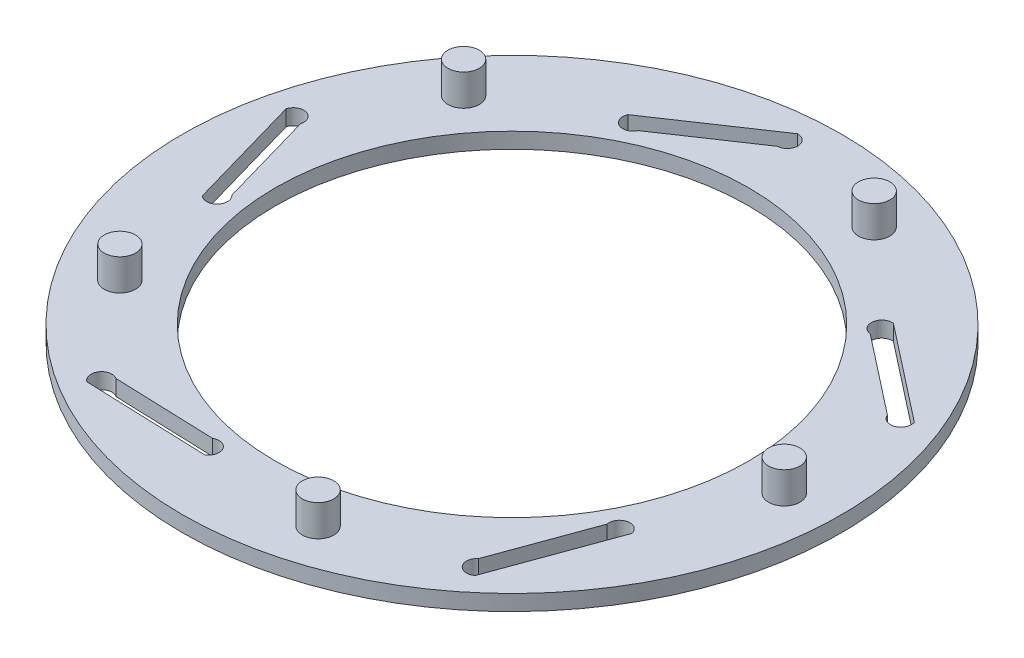
ISO-10303-21;
HEADER;
FILE_DESCRIPTION(('STEP AP214'),'2;1');
FILE_NAME('part.step','',(''),(''),'','','');
FILE_SCHEMA(('AUTOMOTIVE_DESIGN { 1 0 10303 214 1 1 1 1 }'));
ENDSEC;
DATA;
#1=APPLICATION_CONTEXT('core data for automotive mechanical design processes');
#2=APPLICATION_PROTOCOL_DEFINITION('international standard','automotive_design',2000,#1);
#3=PRODUCT_CONTEXT('',#1,'mechanical');
#4=PRODUCT('Part','Part','',(#3));
#5=PRODUCT_RELATED_PRODUCT_CATEGORY('part','',(#4));
#6=PRODUCT_DEFINITION_FORMATION('','',#4);
#7=PRODUCT_DEFINITION_CONTEXT('part definition',#1,'design');
#8=PRODUCT_DEFINITION('design','',#6,#7);
#9=PRODUCT_DEFINITION_SHAPE('','',#8);
#10=(LENGTH_UNIT() NAMED_UNIT(*) SI_UNIT(.MILLI.,.METRE.));
#11=(NAMED_UNIT(*) PLANE_ANGLE_UNIT() SI_UNIT($,.RADIAN.));
#12=(NAMED_UNIT(*) SI_UNIT($,.STERADIAN.) SOLID_ANGLE_UNIT());
#13=UNCERTAINTY_MEASURE_WITH_UNIT(LENGTH_MEASURE(1.E-05),#10,'distance_accuracy_value','');
#14=(GEOMETRIC_REPRESENTATION_CONTEXT(3) GLOBAL_UNCERTAINTY_ASSIGNED_CONTEXT((#13)) GLOBAL_UNIT_ASSIGNED_CONTEXT((#10,
#11,#12)) REPRESENTATION_CONTEXT('',''));
#15=CARTESIAN_POINT('',(0.,0.,0.));
#16=DIRECTION('',(0.,0.,1.));
#17=DIRECTION('',(1.,0.,0.));
#18=AXIS2_PLACEMENT_3D('',#15,#16,#17);
#19=CARTESIAN_POINT('',(-24.6164911308151,1.5,7.04147544452929));
#20=DIRECTION('',(-0.961439383617259,0.,0.275016929714635));
#21=DIRECTION('',(0.275016929714635,0.,0.961439383617259));
#22=AXIS2_PLACEMENT_3D('',#19,#20,#21);
#23=PLANE('',#22);
#24=DIRECTION('',(-0.275016929714635,0.,-0.961439383617259));
#25=VECTOR('',#24,1.);
#26=CARTESIAN_POINT('',(-24.6164911308151,0.,7.04147544452929));
#27=LINE('',#26,#25);
#28=CARTESIAN_POINT('',(-25.4396115620849,0.,4.16390568580963));
#29=VERTEX_POINT('',#28);
#30=CARTESIAN_POINT('',(-28.6472570750445,0.,-7.04979206015319));
#31=VERTEX_POINT('',#30);
#32=EDGE_CURVE('E284',#29,#31,#27,.T.);
#33=ORIENTED_EDGE('',*,*,#32,.T.);
#34=DIRECTION('',(0.,-1.,0.));
#35=VECTOR('',#34,1.);
#36=CARTESIAN_POINT('',(-28.6472570750445,1.5,-7.04979206015319));
#37=LINE('',#36,#35);
#38=CARTESIAN_POINT('',(-28.6472570750445,1.5,-7.04979206015319));
#39=VERTEX_POINT('',#38);
#40=EDGE_CURVE('E11',#39,#31,#37,.T.);
#41=ORIENTED_EDGE('',*,*,#40,.F.);
#42=DIRECTION('',(-0.275016929714635,0.,-0.961439383617259));
#43=VECTOR('',#42,1.);
#44=CARTESIAN_POINT('',(-24.6164911308151,1.5,7.04147544452929));
#45=LINE('',#44,#43);
#46=CARTESIAN_POINT('',(-25.4396115620849,1.5,4.16390568580963));
#47=VERTEX_POINT('',#46);
#48=EDGE_CURVE('E194',#47,#39,#45,.T.);
#49=ORIENTED_EDGE('',*,*,#48,.F.);
#50=DIRECTION('',(0.,-1.,0.));
#51=VECTOR('',#50,1.);
#52=CARTESIAN_POINT('',(-25.4396115620849,1.5,4.16390568580963));
#53=LINE('',#52,#51);
#54=EDGE_CURVE('E61',#47,#29,#53,.T.);
#55=ORIENTED_EDGE('',*,*,#54,.T.);
#56=EDGE_LOOP('',(#33,#41,#49,#55));
#57=FACE_BOUND('',#56,.T.);
#58=ADVANCED_FACE('F41',(#57),#23,.F.);
#59=CARTESIAN_POINT('',(-27.6839846912849,1.5,-6.78126587020875));
#60=DIRECTION('',(0.,-1.,0.));
#61=DIRECTION('',(0.,0.,-1.));
#62=AXIS2_PLACEMENT_3D('',#59,#60,#61);
#63=CYLINDRICAL_SURFACE('',#62,1.);
#64=CARTESIAN_POINT('',(-27.6839846912849,0.,-6.78126587020875));
#65=DIRECTION('',(0.,1.,0.));
#66=DIRECTION('',(0.,0.,1.));
#67=AXIS2_PLACEMENT_3D('',#64,#65,#66);
#68=CIRCLE('',#67,1.);
#69=CARTESIAN_POINT('',(-26.7207123075253,0.,-6.51273968026431));
#70=VERTEX_POINT('',#69);
#71=EDGE_CURVE('E201',#31,#70,#68,.F.);
#72=ORIENTED_EDGE('',*,*,#71,.T.);
#73=DIRECTION('',(0.,-1.,0.));
#74=VECTOR('',#73,1.);
#75=CARTESIAN_POINT('',(-26.7207123075253,1.5,-6.51273968026431));
#76=LINE('',#75,#74);
#77=CARTESIAN_POINT('',(-26.7207123075253,1.5,-6.51273968026431));
#78=VERTEX_POINT('',#77);
#79=EDGE_CURVE('E52',#78,#70,#76,.T.);
#80=ORIENTED_EDGE('',*,*,#79,.F.);
#81=CARTESIAN_POINT('',(-27.6839846912849,1.5,-6.78126587020875));
#82=DIRECTION('',(0.,1.,0.));
#83=DIRECTION('',(0.,0.,1.));
#84=AXIS2_PLACEMENT_3D('',#81,#82,#83);
#85=CIRCLE('',#84,1.);
#86=EDGE_CURVE('E188',#39,#78,#85,.F.);
#87=ORIENTED_EDGE('',*,*,#86,.F.);
#88=ORIENTED_EDGE('',*,*,#40,.T.);
#89=EDGE_LOOP('',(#72,#80,#87,#88));
#90=FACE_BOUND('',#89,.T.);
#91=ADVANCED_FACE('F200',(#90),#63,.F.);
#92=CARTESIAN_POINT('',(-22.9776624021557,1.5,6.57269326963195));
#93=DIRECTION('',(0.961439383617259,0.,-0.275016929714634));
#94=DIRECTION('',(-0.275016929714634,0.,-0.96143938361726));
#95=AXIS2_PLACEMENT_3D('',#92,#93,#94);
#96=PLANE('',#95);
#97=DIRECTION('',(0.275016929714634,0.,0.96143938361726));
#98=VECTOR('',#97,1.);
#99=CARTESIAN_POINT('',(-22.9776624021557,0.,6.57269326963195));
#100=LINE('',#99,#98);
#101=CARTESIAN_POINT('',(-24.0884988722853,0.,2.6892889561261));
#102=VERTEX_POINT('',#101);
#103=EDGE_CURVE('E289',#70,#102,#100,.T.);
#104=ORIENTED_EDGE('',*,*,#103,.T.);
#105=DIRECTION('',(0.,-1.,0.));
#106=VECTOR('',#105,1.);
#107=CARTESIAN_POINT('',(-24.0884988722853,1.5,2.6892889561261));
#108=LINE('',#107,#106);
#109=CARTESIAN_POINT('',(-24.0884988722853,1.5,2.6892889561261));
#110=VERTEX_POINT('',#109);
#111=EDGE_CURVE('E124',#110,#102,#108,.T.);
#112=ORIENTED_EDGE('',*,*,#111,.F.);
#113=DIRECTION('',(0.275016929714634,0.,0.96143938361726));
#114=VECTOR('',#113,1.);
#115=CARTESIAN_POINT('',(-22.9776624021557,1.5,6.57269326963195));
#116=LINE('',#115,#114);
#117=EDGE_CURVE('E193',#78,#110,#116,.T.);
#118=ORIENTED_EDGE('',*,*,#117,.F.);
#119=ORIENTED_EDGE('',*,*,#79,.T.);
#120=EDGE_LOOP('',(#104,#112,#118,#119));
#121=FACE_BOUND('',#120,.T.);
#122=ADVANCED_FACE('F206',(#121),#96,.F.);
#123=CARTESIAN_POINT('',(-0.910072995450213,1.5,25.5876098761187));
#124=DIRECTION('',(-0.0355444655025184,0.,0.999368095834633));
#125=DIRECTION('',(0.999368095834633,0.,0.0355444655025184));
#126=AXIS2_PLACEMENT_3D('',#123,#124,#125);
#127=PLANE('',#126);
#128=DIRECTION('',(-0.999368095834633,0.,-0.0355444655025184));
#129=VECTOR('',#128,1.);
#130=CARTESIAN_POINT('',(-0.910072995450213,0.,25.5876098761187));
#131=LINE('',#130,#129);
#132=CARTESIAN_POINT('',(-3.90116266725078,0.,25.4812259680298));
#133=VERTEX_POINT('',#132);
#134=CARTESIAN_POINT('',(-15.5572399557481,0.,25.0666549618084));
#135=VERTEX_POINT('',#134);
#136=EDGE_CURVE('E269',#133,#135,#131,.T.);
#137=ORIENTED_EDGE('',*,*,#136,.T.);
#138=DIRECTION('',(0.,-1.,0.));
#139=VECTOR('',#138,1.);
#140=CARTESIAN_POINT('',(-15.5572399557481,1.5,25.0666549618084));
#141=LINE('',#140,#139);
#142=CARTESIAN_POINT('',(-15.5572399557481,1.5,25.0666549618084));
#143=VERTEX_POINT('',#142);
#144=EDGE_CURVE('E299',#143,#135,#141,.T.);
#145=ORIENTED_EDGE('',*,*,#144,.F.);
#146=DIRECTION('',(-0.999368095834633,0.,-0.0355444655025184));
#147=VECTOR('',#146,1.);
#148=CARTESIAN_POINT('',(-0.910072995450213,1.5,25.5876098761187));
#149=LINE('',#148,#147);
#150=CARTESIAN_POINT('',(-3.90116266725078,1.5,25.4812259680298));
#151=VERTEX_POINT('',#150);
#152=EDGE_CURVE('E779',#151,#143,#149,.T.);
#153=ORIENTED_EDGE('',*,*,#152,.F.);
#154=DIRECTION('',(0.,-1.,0.));
#155=VECTOR('',#154,1.);
#156=CARTESIAN_POINT('',(-3.90116266725078,1.5,25.4812259680298));
#157=LINE('',#156,#155);
#158=EDGE_CURVE('E302',#151,#133,#157,.T.);
#159=ORIENTED_EDGE('',*,*,#158,.T.);
#160=EDGE_LOOP('',(#137,#145,#153,#159));
#161=FACE_BOUND('',#160,.T.);
#162=ADVANCED_FACE('F399',(#161),#127,.F.);
#163=CARTESIAN_POINT('',(-15.0041888362117,1.5,24.2335076403943));
#164=DIRECTION('',(0.,-1.,0.));
#165=DIRECTION('',(0.,0.,-1.));
#166=AXIS2_PLACEMENT_3D('',#163,#164,#165);
#167=CYLINDRICAL_SURFACE('',#166,1.00000000000001);
#168=CARTESIAN_POINT('',(-15.0041888362117,0.,24.2335076403943));
#169=DIRECTION('',(0.,1.,0.));
#170=DIRECTION('',(0.,0.,1.));
#171=AXIS2_PLACEMENT_3D('',#168,#169,#170);
#172=CIRCLE('',#171,1.00000000000001);
#173=CARTESIAN_POINT('',(-14.4511377166754,0.,23.4003603189801));
#174=VERTEX_POINT('',#173);
#175=EDGE_CURVE('E273',#135,#174,#172,.F.);
#176=ORIENTED_EDGE('',*,*,#175,.T.);
#177=DIRECTION('',(0.,-1.,0.));
#178=VECTOR('',#177,1.);
#179=CARTESIAN_POINT('',(-14.4511377166754,1.5,23.4003603189801));
#180=LINE('',#179,#178);
#181=CARTESIAN_POINT('',(-14.4511377166754,1.5,23.4003603189801));
#182=VERTEX_POINT('',#181);
#183=EDGE_CURVE('E309',#182,#174,#180,.T.);
#184=ORIENTED_EDGE('',*,*,#183,.F.);
#185=CARTESIAN_POINT('',(-15.0041888362117,1.5,24.2335076403943));
#186=DIRECTION('',(0.,1.,0.));
#187=DIRECTION('',(0.,0.,1.));
#188=AXIS2_PLACEMENT_3D('',#185,#186,#187);
#189=CIRCLE('',#188,1.00000000000001);
#190=EDGE_CURVE('E783',#143,#182,#189,.F.);
#191=ORIENTED_EDGE('',*,*,#190,.F.);
#192=ORIENTED_EDGE('',*,*,#144,.T.);
#193=EDGE_LOOP('',(#176,#184,#191,#192));
#194=FACE_BOUND('',#193,.T.);
#195=ADVANCED_FACE('F395',(#194),#167,.F.);
#196=CARTESIAN_POINT('',(-0.849485409583704,1.5,23.8841294759322));
#197=DIRECTION('',(0.0355444655025191,0.,-0.999368095834633));
#198=DIRECTION('',(-0.999368095834633,0.,-0.0355444655025191));
#199=AXIS2_PLACEMENT_3D('',#196,#197,#198);
#200=PLANE('',#199);
#201=DIRECTION('',(0.999368095834633,0.,0.0355444655025191));
#202=VECTOR('',#201,1.);
#203=CARTESIAN_POINT('',(-0.849485409583704,0.,23.8841294759322));
#204=LINE('',#203,#202);
#205=CARTESIAN_POINT('',(-4.88608973459044,0.,23.740559810485));
#206=VERTEX_POINT('',#205);
#207=EDGE_CURVE('E276',#174,#206,#204,.T.);
#208=ORIENTED_EDGE('',*,*,#207,.T.);
#209=DIRECTION('',(0.,-1.,0.));
#210=VECTOR('',#209,1.);
#211=CARTESIAN_POINT('',(-4.88608973459044,1.5,23.740559810485));
#212=LINE('',#211,#210);
#213=CARTESIAN_POINT('',(-4.88608973459044,1.5,23.740559810485));
#214=VERTEX_POINT('',#213);
#215=EDGE_CURVE('E305',#214,#206,#212,.T.);
#216=ORIENTED_EDGE('',*,*,#215,.F.);
#217=DIRECTION('',(0.999368095834633,0.,0.0355444655025191));
#218=VECTOR('',#217,1.);
#219=CARTESIAN_POINT('',(-0.849485409583704,1.5,23.8841294759322));
#220=LINE('',#219,#218);
#221=EDGE_CURVE('E786',#182,#214,#220,.T.);
#222=ORIENTED_EDGE('',*,*,#221,.F.);
#223=ORIENTED_EDGE('',*,*,#183,.T.);
#224=EDGE_LOOP('',(#208,#216,#222,#223));
#225=FACE_BOUND('',#224,.T.);
#226=ADVANCED_FACE('F391',(#225),#200,.F.);
#227=CARTESIAN_POINT('',(24.0540350873885,1.5,8.77253714978533));
#228=DIRECTION('',(0.939471695824755,0.,0.342626520783431));
#229=DIRECTION('',(0.342626520783431,0.,-0.939471695824755));
#230=AXIS2_PLACEMENT_3D('',#227,#228,#229);
#231=PLANE('',#230);
#232=DIRECTION('',(-0.342626520783431,0.,0.939471695824755));
#233=VECTOR('',#232,1.);
#234=CARTESIAN_POINT('',(24.0540350873885,0.,8.77253714978533));
#235=LINE('',#234,#233);
#236=CARTESIAN_POINT('',(23.0285604380856,0.,11.5843580374475));
#237=VERTEX_POINT('',#236);
#238=CARTESIAN_POINT('',(19.0323540112582,0.,22.5418368108153));
#239=VERTEX_POINT('',#238);
#240=EDGE_CURVE('E254',#237,#239,#235,.T.);
#241=ORIENTED_EDGE('',*,*,#240,.T.);
#242=DIRECTION('',(0.,-1.,0.));
#243=VECTOR('',#242,1.);
#244=CARTESIAN_POINT('',(19.0323540112582,1.5,22.5418368108153));
#245=LINE('',#244,#243);
#246=CARTESIAN_POINT('',(19.0323540112582,1.5,22.5418368108153));
#247=VERTEX_POINT('',#246);
#248=EDGE_CURVE('E306',#247,#239,#245,.T.);
#249=ORIENTED_EDGE('',*,*,#248,.F.);
#250=DIRECTION('',(-0.342626520783431,0.,0.939471695824755));
#251=VECTOR('',#250,1.);
#252=CARTESIAN_POINT('',(24.0540350873885,1.5,8.77253714978533));
#253=LINE('',#252,#251);
#254=CARTESIAN_POINT('',(23.0285604380856,1.5,11.5843580374475));
#255=VERTEX_POINT('',#254);
#256=EDGE_CURVE('E765',#255,#247,#253,.T.);
#257=ORIENTED_EDGE('',*,*,#256,.F.);
#258=DIRECTION('',(0.,-1.,0.));
#259=VECTOR('',#258,1.);
#260=CARTESIAN_POINT('',(23.0285604380856,1.5,11.5843580374475));
#261=LINE('',#260,#259);
#262=EDGE_CURVE('E316',#255,#237,#261,.T.);
#263=ORIENTED_EDGE('',*,*,#262,.T.);
#264=EDGE_LOOP('',(#241,#249,#257,#263));
#265=FACE_BOUND('',#264,.T.);
#266=ADVANCED_FACE('F394',(#265),#231,.F.);
#267=CARTESIAN_POINT('',(18.4108860168882,1.5,21.7583972586009));
#268=DIRECTION('',(0.,-1.,0.));
#269=DIRECTION('',(0.,0.,-1.));
#270=AXIS2_PLACEMENT_3D('',#267,#268,#269);
#271=CYLINDRICAL_SURFACE('',#270,1.);
#272=CARTESIAN_POINT('',(18.4108860168882,0.,21.7583972586009));
#273=DIRECTION('',(0.,1.,0.));
#274=DIRECTION('',(0.,0.,1.));
#275=AXIS2_PLACEMENT_3D('',#272,#273,#274);
#276=CIRCLE('',#275,1.);
#277=CARTESIAN_POINT('',(17.7894180225183,0.,20.9749577063866));
#278=VERTEX_POINT('',#277);
#279=EDGE_CURVE('E258',#239,#278,#276,.F.);
#280=ORIENTED_EDGE('',*,*,#279,.T.);
#281=DIRECTION('',(0.,-1.,0.));
#282=VECTOR('',#281,1.);
#283=CARTESIAN_POINT('',(17.7894180225183,1.5,20.9749577063866));
#284=LINE('',#283,#282);
#285=CARTESIAN_POINT('',(17.7894180225183,1.5,20.9749577063866));
#286=VERTEX_POINT('',#285);
#287=EDGE_CURVE('E323',#286,#278,#284,.T.);
#288=ORIENTED_EDGE('',*,*,#287,.F.);
#289=CARTESIAN_POINT('',(18.4108860168882,1.5,21.7583972586009));
#290=DIRECTION('',(0.,1.,0.));
#291=DIRECTION('',(0.,0.,1.));
#292=AXIS2_PLACEMENT_3D('',#289,#290,#291);
#293=CIRCLE('',#292,1.);
#294=EDGE_CURVE('E769',#247,#286,#293,.F.);
#295=ORIENTED_EDGE('',*,*,#294,.F.);
#296=ORIENTED_EDGE('',*,*,#248,.T.);
#297=EDGE_LOOP('',(#280,#288,#295,#296));
#298=FACE_BOUND('',#297,.T.);
#299=ADVANCED_FACE('F412',(#298),#271,.F.);
#300=CARTESIAN_POINT('',(22.4526515460909,1.5,8.1885105381981));
#301=DIRECTION('',(-0.939471695824755,0.,-0.342626520783431));
#302=DIRECTION('',(-0.342626520783431,0.,0.939471695824755));
#303=AXIS2_PLACEMENT_3D('',#300,#301,#302);
#304=PLANE('',#303);
#305=DIRECTION('',(0.342626520783432,0.,-0.939471695824755));
#306=VECTOR('',#305,1.);
#307=CARTESIAN_POINT('',(22.4526515460909,0.,8.1885105381981));
#308=LINE('',#307,#306);
#309=CARTESIAN_POINT('',(21.0687293442304,0.,11.9831839187016));
#310=VERTEX_POINT('',#309);
#311=EDGE_CURVE('E261',#278,#310,#308,.T.);
#312=ORIENTED_EDGE('',*,*,#311,.T.);
#313=DIRECTION('',(0.,-1.,0.));
#314=VECTOR('',#313,1.);
#315=CARTESIAN_POINT('',(21.0687293442304,1.5,11.9831839187016));
#316=LINE('',#315,#314);
#317=CARTESIAN_POINT('',(21.0687293442304,1.5,11.9831839187016));
#318=VERTEX_POINT('',#317);
#319=EDGE_CURVE('E319',#318,#310,#316,.T.);
#320=ORIENTED_EDGE('',*,*,#319,.F.);
#321=DIRECTION('',(0.342626520783432,0.,-0.939471695824755));
#322=VECTOR('',#321,1.);
#323=CARTESIAN_POINT('',(22.4526515460909,1.5,8.1885105381981));
#324=LINE('',#323,#322);
#325=EDGE_CURVE('E772',#286,#318,#324,.T.);
#326=ORIENTED_EDGE('',*,*,#325,.F.);
#327=ORIENTED_EDGE('',*,*,#287,.T.);
#328=EDGE_LOOP('',(#312,#320,#326,#327));
#329=FACE_BOUND('',#328,.T.);
#330=ADVANCED_FACE('F408',(#329),#304,.F.);
#331=CARTESIAN_POINT('',(15.7762842460393,1.5,-20.1658837499842));
#332=DIRECTION('',(0.61616990499072,0.,-0.78761326054335));
#333=DIRECTION('',(-0.78761326054335,0.,-0.61616990499072));
#334=AXIS2_PLACEMENT_3D('',#331,#332,#333);
#335=PLANE('',#334);
#336=DIRECTION('',(0.78761326054335,0.,0.61616990499072));
#337=VECTOR('',#336,1.);
#338=CARTESIAN_POINT('',(15.7762842460393,0.,-20.1658837499842));
#339=LINE('',#338,#337);
#340=CARTESIAN_POINT('',(18.1335957299727,0.,-18.321698963041));
#341=VERTEX_POINT('',#340);
#342=CARTESIAN_POINT('',(27.31988162063,0.,-11.1350336438728));
#343=VERTEX_POINT('',#342);
#344=EDGE_CURVE('E239',#341,#343,#339,.T.);
#345=ORIENTED_EDGE('',*,*,#344,.T.);
#346=DIRECTION('',(0.,-1.,0.));
#347=VECTOR('',#346,1.);
#348=CARTESIAN_POINT('',(27.31988162063,1.5,-11.1350336438728));
#349=LINE('',#348,#347);
#350=CARTESIAN_POINT('',(27.31988162063,1.5,-11.1350336438728));
#351=VERTEX_POINT('',#350);
#352=EDGE_CURVE('E320',#351,#343,#349,.T.);
#353=ORIENTED_EDGE('',*,*,#352,.F.);
#354=DIRECTION('',(0.78761326054335,0.,0.61616990499072));
#355=VECTOR('',#354,1.);
#356=CARTESIAN_POINT('',(15.7762842460393,1.5,-20.1658837499842));
#357=LINE('',#356,#355);
#358=CARTESIAN_POINT('',(18.1335957299727,1.5,-18.321698963041));
#359=VERTEX_POINT('',#358);
#360=EDGE_CURVE('E751',#359,#351,#357,.T.);
#361=ORIENTED_EDGE('',*,*,#360,.F.);
#362=DIRECTION('',(0.,-1.,0.));
#363=VECTOR('',#362,1.);
#364=CARTESIAN_POINT('',(18.1335957299727,1.5,-18.321698963041));
#365=LINE('',#364,#363);
#366=EDGE_CURVE('E330',#359,#341,#365,.T.);
#367=ORIENTED_EDGE('',*,*,#366,.T.);
#368=EDGE_LOOP('',(#345,#353,#361,#367));
#369=FACE_BOUND('',#368,.T.);
#370=ADVANCED_FACE('F411',(#369),#335,.F.);
#371=CARTESIAN_POINT('',(26.3827421576527,1.5,-10.7860785938581));
#372=DIRECTION('',(0.,-1.,0.));
#373=DIRECTION('',(0.,0.,-1.));
#374=AXIS2_PLACEMENT_3D('',#371,#372,#373);
#375=CYLINDRICAL_SURFACE('',#374,1.);
#376=CARTESIAN_POINT('',(26.3827421576527,0.,-10.7860785938581));
#377=DIRECTION('',(0.,1.,0.));
#378=DIRECTION('',(0.,0.,1.));
#379=AXIS2_PLACEMENT_3D('',#376,#377,#378);
#380=CIRCLE('',#379,1.);
#381=CARTESIAN_POINT('',(25.4456026946755,0.,-10.4371235438434));
#382=VERTEX_POINT('',#381);
#383=EDGE_CURVE('E243',#343,#382,#380,.F.);
#384=ORIENTED_EDGE('',*,*,#383,.T.);
#385=DIRECTION('',(0.,-1.,0.));
#386=VECTOR('',#385,1.);
#387=CARTESIAN_POINT('',(25.4456026946755,1.5,-10.4371235438434));
#388=LINE('',#387,#386);
#389=CARTESIAN_POINT('',(25.4456026946755,1.5,-10.4371235438434));
#390=VERTEX_POINT('',#389);
#391=EDGE_CURVE('E336',#390,#382,#388,.T.);
#392=ORIENTED_EDGE('',*,*,#391,.F.);
#393=CARTESIAN_POINT('',(26.3827421576527,1.5,-10.7860785938581));
#394=DIRECTION('',(0.,1.,0.));
#395=DIRECTION('',(0.,0.,1.));
#396=AXIS2_PLACEMENT_3D('',#393,#394,#395);
#397=CIRCLE('',#396,1.);
#398=EDGE_CURVE('E755',#351,#390,#397,.F.);
#399=ORIENTED_EDGE('',*,*,#398,.F.);
#400=ORIENTED_EDGE('',*,*,#352,.T.);
#401=EDGE_LOOP('',(#384,#392,#399,#400));
#402=FACE_BOUND('',#401,.T.);
#403=ADVANCED_FACE('F426',(#402),#375,.F.);
#404=CARTESIAN_POINT('',(14.7259872026262,1.5,-18.823351646093));
#405=DIRECTION('',(-0.61616990499072,0.,0.78761326054335));
#406=DIRECTION('',(0.78761326054335,0.,0.61616990499072));
#407=AXIS2_PLACEMENT_3D('',#404,#405,#406);
#408=PLANE('',#407);
#409=DIRECTION('',(-0.78761326054335,0.,-0.61616990499072));
#410=VECTOR('',#409,1.);
#411=CARTESIAN_POINT('',(14.7259872026262,0.,-18.823351646093));
#412=LINE('',#411,#410);
#413=CARTESIAN_POINT('',(17.907280569101,0.,-16.334544855288));
#414=VERTEX_POINT('',#413);
#415=EDGE_CURVE('E246',#382,#414,#412,.T.);
#416=ORIENTED_EDGE('',*,*,#415,.T.);
#417=DIRECTION('',(0.,-1.,0.));
#418=VECTOR('',#417,1.);
#419=CARTESIAN_POINT('',(17.907280569101,1.5,-16.334544855288));
#420=LINE('',#419,#418);
#421=CARTESIAN_POINT('',(17.907280569101,1.5,-16.334544855288));
#422=VERTEX_POINT('',#421);
#423=EDGE_CURVE('E333',#422,#414,#420,.T.);
#424=ORIENTED_EDGE('',*,*,#423,.F.);
#425=DIRECTION('',(-0.78761326054335,0.,-0.61616990499072));
#426=VECTOR('',#425,1.);
#427=CARTESIAN_POINT('',(14.7259872026262,1.5,-18.823351646093));
#428=LINE('',#427,#426);
#429=EDGE_CURVE('E758',#390,#422,#428,.T.);
#430=ORIENTED_EDGE('',*,*,#429,.F.);
#431=ORIENTED_EDGE('',*,*,#391,.T.);
#432=EDGE_LOOP('',(#416,#424,#430,#431));
#433=FACE_BOUND('',#432,.T.);
#434=ADVANCED_FACE('F423',(#433),#408,.F.);
#435=CARTESIAN_POINT('',(-14.3037552071553,1.5,-21.2357387204523));
#436=DIRECTION('',(-0.558657751695696,0.,-0.829398285789348));
#437=DIRECTION('',(-0.829398285789348,0.,0.558657751695697));
#438=AXIS2_PLACEMENT_3D('',#435,#436,#437);
#439=PLANE('',#438);
#440=DIRECTION('',(0.829398285789348,0.,-0.558657751695696));
#441=VECTOR('',#440,1.);
#442=CARTESIAN_POINT('',(-14.3037552071553,0.,-21.2357387204523));
#443=LINE('',#442,#441);
#444=CARTESIAN_POINT('',(-11.8213819387086,0.,-22.9077907282523));
#445=VERTEX_POINT('',#444);
#446=CARTESIAN_POINT('',(-2.14773860108144,0.,-29.423666068604));
#447=VERTEX_POINT('',#446);
#448=EDGE_CURVE('E224',#445,#447,#443,.T.);
#449=ORIENTED_EDGE('',*,*,#448,.T.);
#450=DIRECTION('',(0.,-1.,0.));
#451=VECTOR('',#450,1.);
#452=CARTESIAN_POINT('',(-2.14773860108144,1.5,-29.423666068604));
#453=LINE('',#452,#451);
#454=CARTESIAN_POINT('',(-2.14773860108144,1.5,-29.423666068604));
#455=VERTEX_POINT('',#454);
#456=EDGE_CURVE('E45',#455,#447,#453,.T.);
#457=ORIENTED_EDGE('',*,*,#456,.F.);
#458=DIRECTION('',(0.829398285789348,0.,-0.558657751695696));
#459=VECTOR('',#458,1.);
#460=CARTESIAN_POINT('',(-14.3037552071553,1.5,-21.2357387204523));
#461=LINE('',#460,#459);
#462=CARTESIAN_POINT('',(-11.8213819387086,1.5,-22.9077907282523));
#463=VERTEX_POINT('',#462);
#464=EDGE_CURVE('E741',#463,#455,#461,.T.);
#465=ORIENTED_EDGE('',*,*,#464,.F.);
#466=DIRECTION('',(0.,-1.,0.));
#467=VECTOR('',#466,1.);
#468=CARTESIAN_POINT('',(-11.8213819387086,1.5,-22.9077907282523));
#469=LINE('',#468,#467);
#470=EDGE_CURVE('E211',#463,#445,#469,.T.);
#471=ORIENTED_EDGE('',*,*,#470,.T.);
#472=EDGE_LOOP('',(#449,#457,#465,#471));
#473=FACE_BOUND('',#472,.T.);
#474=ADVANCED_FACE('F359',(#473),#439,.F.);
#475=CARTESIAN_POINT('',(-2.10545464703022,1.5,-28.4245604349347));
#476=DIRECTION('',(0.,-1.,0.));
#477=DIRECTION('',(0.,0.,-1.));
#478=AXIS2_PLACEMENT_3D('',#475,#476,#477);
#479=CYLINDRICAL_SURFACE('',#478,1.);
#480=CARTESIAN_POINT('',(-2.10545464703022,0.,-28.4245604349347));
#481=DIRECTION('',(0.,1.,0.));
#482=DIRECTION('',(0.,0.,1.));
#483=AXIS2_PLACEMENT_3D('',#480,#481,#482);
#484=CIRCLE('',#483,1.);
#485=CARTESIAN_POINT('',(-2.06317069297901,0.,-27.4254548012654));
#486=VERTEX_POINT('',#485);
#487=EDGE_CURVE('E228',#447,#486,#484,.F.);
#488=ORIENTED_EDGE('',*,*,#487,.T.);
#489=DIRECTION('',(0.,-1.,0.));
#490=VECTOR('',#489,1.);
#491=CARTESIAN_POINT('',(-2.06317069297901,1.5,-27.4254548012654));
#492=LINE('',#491,#490);
#493=CARTESIAN_POINT('',(-2.06317069297901,1.5,-27.4254548012654));
#494=VERTEX_POINT('',#493);
#495=EDGE_CURVE('E347',#494,#486,#492,.T.);
#496=ORIENTED_EDGE('',*,*,#495,.F.);
#497=CARTESIAN_POINT('',(-2.10545464703022,1.5,-28.4245604349347));
#498=DIRECTION('',(0.,1.,0.));
#499=DIRECTION('',(0.,0.,1.));
#500=AXIS2_PLACEMENT_3D('',#497,#498,#499);
#501=CIRCLE('',#500,1.);
#502=EDGE_CURVE('E137',#455,#494,#501,.F.);
#503=ORIENTED_EDGE('',*,*,#502,.F.);
#504=ORIENTED_EDGE('',*,*,#456,.T.);
#505=EDGE_LOOP('',(#488,#496,#503,#504));
#506=FACE_BOUND('',#505,.T.);
#507=ADVANCED_FACE('F355',(#506),#479,.F.);
#508=CARTESIAN_POINT('',(-13.3514909369706,1.5,-19.8219816376724));
#509=DIRECTION('',(0.558657751695697,0.,0.829398285789348));
#510=DIRECTION('',(0.829398285789348,0.,-0.558657751695697));
#511=AXIS2_PLACEMENT_3D('',#508,#509,#510);
#512=PLANE('',#511);
#513=DIRECTION('',(-0.829398285789348,0.,0.558657751695697));
#514=VECTOR('',#513,1.);
#515=CARTESIAN_POINT('',(-13.3514909369706,0.,-19.8219816376724));
#516=LINE('',#515,#514);
#517=CARTESIAN_POINT('',(-10.0014213064415,0.,-22.0784878300311));
#518=VERTEX_POINT('',#517);
#519=EDGE_CURVE('E231',#486,#518,#516,.T.);
#520=ORIENTED_EDGE('',*,*,#519,.T.);
#521=DIRECTION('',(0.,-1.,0.));
#522=VECTOR('',#521,1.);
#523=CARTESIAN_POINT('',(-10.0014213064415,1.5,-22.0784878300311));
#524=LINE('',#523,#522);
#525=CARTESIAN_POINT('',(-10.0014213064415,1.5,-22.0784878300311));
#526=VERTEX_POINT('',#525);
#527=EDGE_CURVE('E345',#526,#518,#524,.T.);
#528=ORIENTED_EDGE('',*,*,#527,.F.);
#529=DIRECTION('',(-0.829398285789348,0.,0.558657751695697));
#530=VECTOR('',#529,1.);
#531=CARTESIAN_POINT('',(-13.3514909369706,1.5,-19.8219816376724));
#532=LINE('',#531,#530);
#533=EDGE_CURVE('E746',#494,#526,#532,.T.);
#534=ORIENTED_EDGE('',*,*,#533,.F.);
#535=ORIENTED_EDGE('',*,*,#495,.T.);
#536=EDGE_LOOP('',(#520,#528,#534,#535));
#537=FACE_BOUND('',#536,.T.);
#538=ADVANCED_FACE('F370',(#537),#512,.F.);
#539=CARTESIAN_POINT('',(-4.39362620092061,1.5,24.6108928892574));
#540=DIRECTION('',(0.,-1.,0.));
#541=DIRECTION('',(0.,0.,-1.));
#542=AXIS2_PLACEMENT_3D('',#539,#540,#541);
#543=CYLINDRICAL_SURFACE('',#542,1.);
#544=CARTESIAN_POINT('',(-4.39362620092061,0.,24.6108928892574));
#545=DIRECTION('',(0.,1.,0.));
#546=DIRECTION('',(0.,0.,1.));
#547=AXIS2_PLACEMENT_3D('',#544,#545,#546);
#548=CIRCLE('',#547,1.);
#549=EDGE_CURVE('E280',#133,#206,#548,.T.);
#550=ORIENTED_EDGE('',*,*,#549,.F.);
#551=ORIENTED_EDGE('',*,*,#158,.F.);
#552=CARTESIAN_POINT('',(-4.39362620092061,1.5,24.6108928892574));
#553=DIRECTION('',(0.,1.,0.));
#554=DIRECTION('',(0.,0.,1.));
#555=AXIS2_PLACEMENT_3D('',#552,#553,#554);
#556=CIRCLE('',#555,1.);
#557=EDGE_CURVE('E789',#151,#214,#556,.T.);
#558=ORIENTED_EDGE('',*,*,#557,.T.);
#559=ORIENTED_EDGE('',*,*,#215,.T.);
#560=EDGE_LOOP('',(#550,#551,#558,#559));
#561=FACE_BOUND('',#560,.T.);
#562=ADVANCED_FACE('F372',(#561),#543,.F.);
#563=CARTESIAN_POINT('',(22.048644891158,1.5,11.7837709780746));
#564=DIRECTION('',(0.,-1.,0.));
#565=DIRECTION('',(0.,0.,-1.));
#566=AXIS2_PLACEMENT_3D('',#563,#564,#565);
#567=CYLINDRICAL_SURFACE('',#566,1.);
#568=CARTESIAN_POINT('',(22.048644891158,0.,11.7837709780746));
#569=DIRECTION('',(0.,1.,0.));
#570=DIRECTION('',(0.,0.,1.));
#571=AXIS2_PLACEMENT_3D('',#568,#569,#570);
#572=CIRCLE('',#571,1.);
#573=EDGE_CURVE('E265',#237,#310,#572,.T.);
#574=ORIENTED_EDGE('',*,*,#573,.F.);
#575=ORIENTED_EDGE('',*,*,#262,.F.);
#576=CARTESIAN_POINT('',(22.048644891158,1.5,11.7837709780746));
#577=DIRECTION('',(0.,1.,0.));
#578=DIRECTION('',(0.,0.,1.));
#579=AXIS2_PLACEMENT_3D('',#576,#577,#578);
#580=CIRCLE('',#579,1.);
#581=EDGE_CURVE('E775',#255,#318,#580,.T.);
#582=ORIENTED_EDGE('',*,*,#581,.T.);
#583=ORIENTED_EDGE('',*,*,#319,.T.);
#584=EDGE_LOOP('',(#574,#575,#582,#583));
#585=FACE_BOUND('',#584,.T.);
#586=ADVANCED_FACE('F378',(#585),#567,.F.);
#587=CARTESIAN_POINT('',(18.0204381495369,1.5,-17.3281219091645));
#588=DIRECTION('',(0.,-1.,0.));
#589=DIRECTION('',(0.,0.,-1.));
#590=AXIS2_PLACEMENT_3D('',#587,#588,#589);
#591=CYLINDRICAL_SURFACE('',#590,1.);
#592=CARTESIAN_POINT('',(18.0204381495369,0.,-17.3281219091645));
#593=DIRECTION('',(0.,1.,0.));
#594=DIRECTION('',(0.,0.,1.));
#595=AXIS2_PLACEMENT_3D('',#592,#593,#594);
#596=CIRCLE('',#595,1.);
#597=EDGE_CURVE('E250',#341,#414,#596,.T.);
#598=ORIENTED_EDGE('',*,*,#597,.F.);
#599=ORIENTED_EDGE('',*,*,#366,.F.);
#600=CARTESIAN_POINT('',(18.0204381495369,1.5,-17.3281219091645));
#601=DIRECTION('',(0.,1.,0.));
#602=DIRECTION('',(0.,0.,1.));
#603=AXIS2_PLACEMENT_3D('',#600,#601,#602);
#604=CIRCLE('',#603,1.);
#605=EDGE_CURVE('E761',#359,#422,#604,.T.);
#606=ORIENTED_EDGE('',*,*,#605,.T.);
#607=ORIENTED_EDGE('',*,*,#423,.T.);
#608=EDGE_LOOP('',(#598,#599,#606,#607));
#609=FACE_BOUND('',#608,.T.);
#610=ADVANCED_FACE('F406',(#609),#591,.F.);
#611=CARTESIAN_POINT('',(-10.911401622575,1.5,-22.4931392791417));
#612=DIRECTION('',(0.,-1.,0.));
#613=DIRECTION('',(0.,0.,-1.));
#614=AXIS2_PLACEMENT_3D('',#611,#612,#613);
#615=CYLINDRICAL_SURFACE('',#614,1.);
#616=CARTESIAN_POINT('',(-10.911401622575,0.,-22.4931392791417));
#617=DIRECTION('',(0.,1.,0.));
#618=DIRECTION('',(0.,0.,1.));
#619=AXIS2_PLACEMENT_3D('',#616,#617,#618);
#620=CIRCLE('',#619,1.);
#621=EDGE_CURVE('E235',#445,#518,#620,.T.);
#622=ORIENTED_EDGE('',*,*,#621,.F.);
#623=ORIENTED_EDGE('',*,*,#470,.F.);
#624=CARTESIAN_POINT('',(-10.911401622575,1.5,-22.4931392791417));
#625=DIRECTION('',(0.,1.,0.));
#626=DIRECTION('',(0.,0.,1.));
#627=AXIS2_PLACEMENT_3D('',#624,#625,#626);
#628=CIRCLE('',#627,1.);
#629=EDGE_CURVE('E369',#463,#526,#628,.T.);
#630=ORIENTED_EDGE('',*,*,#629,.T.);
#631=ORIENTED_EDGE('',*,*,#527,.T.);
#632=EDGE_LOOP('',(#622,#623,#630,#631));
#633=FACE_BOUND('',#632,.T.);
#634=ADVANCED_FACE('F365',(#633),#615,.F.);
#635=CARTESIAN_POINT('',(0.,1.5,0.));
#636=DIRECTION('',(0.,-1.,0.));
#637=DIRECTION('',(0.,0.,-1.));
#638=AXIS2_PLACEMENT_3D('',#635,#636,#637);
#639=CYLINDRICAL_SURFACE('',#638,31.5);
#640=CARTESIAN_POINT('',(0.,1.5,0.));
#641=DIRECTION('',(0.,1.,0.));
#642=DIRECTION('',(0.,0.,1.));
#643=AXIS2_PLACEMENT_3D('',#640,#641,#642);
#644=CIRCLE('',#643,31.5);
#645=CARTESIAN_POINT('',(0.,1.5,31.5));
#646=VERTEX_POINT('',#645);
#647=EDGE_CURVE('E737',#646,#646,#644,.T.);
#648=ORIENTED_EDGE('',*,*,#647,.F.);
#649=EDGE_LOOP('',(#648));
#650=FACE_BOUND('',#649,.T.);
#651=CARTESIAN_POINT('',(0.,0.,0.));
#652=DIRECTION('',(0.,1.,0.));
#653=DIRECTION('',(0.,0.,1.));
#654=AXIS2_PLACEMENT_3D('',#651,#652,#653);
#655=CIRCLE('',#654,31.5);
#656=CARTESIAN_POINT('',(0.,0.,31.5));
#657=VERTEX_POINT('',#656);
#658=EDGE_CURVE('E219',#657,#657,#655,.T.);
#659=ORIENTED_EDGE('',*,*,#658,.T.);
#660=EDGE_LOOP('',(#659));
#661=FACE_BOUND('',#660,.T.);
#662=ADVANCED_FACE('F434',(#650,#661),#639,.T.);
#663=CARTESIAN_POINT('',(0.,1.5,0.));
#664=DIRECTION('',(0.,-1.,0.));
#665=DIRECTION('',(0.,0.,-1.));
#666=AXIS2_PLACEMENT_3D('',#663,#664,#665);
#667=CYLINDRICAL_SURFACE('',#666,22.625);
#668=CARTESIAN_POINT('',(0.,1.5,0.));
#669=DIRECTION('',(0.,1.,0.));
#670=DIRECTION('',(0.,0.,1.));
#671=AXIS2_PLACEMENT_3D('',#668,#669,#670);
#672=CIRCLE('',#671,22.625);
#673=CARTESIAN_POINT('',(0.,1.5,22.625));
#674=VERTEX_POINT('',#673);
#675=EDGE_CURVE('E296',#674,#674,#672,.T.);
#676=ORIENTED_EDGE('',*,*,#675,.T.);
#677=EDGE_LOOP('',(#676));
#678=FACE_BOUND('',#677,.T.);
#679=CARTESIAN_POINT('',(0.,0.,0.));
#680=DIRECTION('',(0.,1.,0.));
#681=DIRECTION('',(0.,0.,1.));
#682=AXIS2_PLACEMENT_3D('',#679,#680,#681);
#683=CIRCLE('',#682,22.625);
#684=CARTESIAN_POINT('',(0.,0.,22.625));
#685=VERTEX_POINT('',#684);
#686=EDGE_CURVE('E215',#685,#685,#683,.T.);
#687=ORIENTED_EDGE('',*,*,#686,.F.);
#688=EDGE_LOOP('',(#687));
#689=FACE_BOUND('',#688,.T.);
#690=ADVANCED_FACE('F43',(#678,#689),#667,.F.);
#691=CARTESIAN_POINT('',(-24.7640552171851,1.5,3.42659732096786));
#692=DIRECTION('',(0.,-1.,0.));
#693=DIRECTION('',(0.,0.,-1.));
#694=AXIS2_PLACEMENT_3D('',#691,#692,#693);
#695=CYLINDRICAL_SURFACE('',#694,1.);
#696=CARTESIAN_POINT('',(-24.7640552171851,0.,3.42659732096786));
#697=DIRECTION('',(0.,1.,0.));
#698=DIRECTION('',(0.,0.,1.));
#699=AXIS2_PLACEMENT_3D('',#696,#697,#698);
#700=CIRCLE('',#699,1.);
#701=EDGE_CURVE('E292',#29,#102,#700,.T.);
#702=ORIENTED_EDGE('',*,*,#701,.F.);
#703=ORIENTED_EDGE('',*,*,#54,.F.);
#704=CARTESIAN_POINT('',(-24.7640552171851,1.5,3.42659732096786));
#705=DIRECTION('',(0.,1.,0.));
#706=DIRECTION('',(0.,0.,1.));
#707=AXIS2_PLACEMENT_3D('',#704,#705,#706);
#708=CIRCLE('',#707,1.);
#709=EDGE_CURVE('E208',#47,#110,#708,.T.);
#710=ORIENTED_EDGE('',*,*,#709,.T.);
#711=ORIENTED_EDGE('',*,*,#111,.T.);
#712=EDGE_LOOP('',(#702,#703,#710,#711));
#713=FACE_BOUND('',#712,.T.);
#714=ADVANCED_FACE('F442',(#713),#695,.F.);
#715=CARTESIAN_POINT('',(0.,1.5,0.));
#716=DIRECTION('',(0.,1.,0.));
#717=DIRECTION('',(0.,0.,1.));
#718=AXIS2_PLACEMENT_3D('',#715,#716,#717);
#719=PLANE('',#718);
#720=CARTESIAN_POINT('',(-22.3946019343418,1.5,15.0824999321172));
#721=DIRECTION('',(0.,1.,0.));
#722=DIRECTION('',(0.,0.,1.));
#723=AXIS2_PLACEMENT_3D('',#720,#721,#722);
#724=CIRCLE('',#723,1.50000000000028);
#725=CARTESIAN_POINT('',(-22.3946019343418,1.5,16.5824999321175));
#726=VERTEX_POINT('',#725);
#727=EDGE_CURVE('E698',#726,#726,#724,.T.);
#728=ORIENTED_EDGE('',*,*,#727,.F.);
#729=EDGE_LOOP('',(#728));
#730=FACE_BOUND('',#729,.T.);
#731=CARTESIAN_POINT('',(7.42399726248892,1.5,25.9592808961751));
#732=DIRECTION('',(0.,1.,0.));
#733=DIRECTION('',(0.,0.,1.));
#734=AXIS2_PLACEMENT_3D('',#731,#732,#733);
#735=CIRCLE('',#734,1.50000000000151);
#736=CARTESIAN_POINT('',(7.42399726248892,1.5,27.4592808961766));
#737=VERTEX_POINT('',#736);
#738=EDGE_CURVE('E697',#737,#737,#735,.T.);
#739=ORIENTED_EDGE('',*,*,#738,.F.);
#740=EDGE_LOOP('',(#739));
#741=FACE_BOUND('',#740,.T.);
#742=CARTESIAN_POINT('',(26.9828845749471,1.5,0.961217985223595));
#743=DIRECTION('',(0.,1.,0.));
#744=DIRECTION('',(0.,0.,1.));
#745=AXIS2_PLACEMENT_3D('',#742,#743,#744);
#746=CIRCLE('',#745,1.50000000000223);
#747=CARTESIAN_POINT('',(26.9828845749471,1.5,2.46121798522582));
#748=VERTEX_POINT('',#747);
#749=EDGE_CURVE('E710',#748,#748,#746,.T.);
#750=ORIENTED_EDGE('',*,*,#749,.F.);
#751=EDGE_LOOP('',(#750));
#752=FACE_BOUND('',#751,.T.);
#753=CARTESIAN_POINT('',(9.25234251934464,1.5,-25.3652155107105));
#754=DIRECTION('',(0.,1.,0.));
#755=DIRECTION('',(0.,0.,1.));
#756=AXIS2_PLACEMENT_3D('',#753,#754,#755);
#757=CIRCLE('',#756,1.50000000000135);
#758=CARTESIAN_POINT('',(9.25234251934464,1.5,-23.8652155107091));
#759=VERTEX_POINT('',#758);
#760=EDGE_CURVE('E716',#759,#759,#757,.T.);
#761=ORIENTED_EDGE('',*,*,#760,.F.);
#762=EDGE_LOOP('',(#761));
#763=FACE_BOUND('',#762,.T.);
#764=CARTESIAN_POINT('',(-21.2646224224353,1.5,-16.6377833028099));
#765=DIRECTION('',(0.,1.,0.));
#766=DIRECTION('',(0.,0.,1.));
#767=AXIS2_PLACEMENT_3D('',#764,#765,#766);
#768=CIRCLE('',#767,1.5);
#769=CARTESIAN_POINT('',(-21.2646224224353,1.5,-15.1377833028099));
#770=VERTEX_POINT('',#769);
#771=EDGE_CURVE('E724',#770,#770,#768,.T.);
#772=ORIENTED_EDGE('',*,*,#771,.F.);
#773=EDGE_LOOP('',(#772));
#774=FACE_BOUND('',#773,.T.);
#775=ORIENTED_EDGE('',*,*,#675,.F.);
#776=EDGE_LOOP('',(#775));
#777=FACE_BOUND('',#776,.T.);
#778=ORIENTED_EDGE('',*,*,#647,.T.);
#779=EDGE_LOOP('',(#778));
#780=FACE_BOUND('',#779,.T.);
#781=ORIENTED_EDGE('',*,*,#464,.T.);
#782=ORIENTED_EDGE('',*,*,#502,.T.);
#783=ORIENTED_EDGE('',*,*,#533,.T.);
#784=ORIENTED_EDGE('',*,*,#629,.F.);
#785=EDGE_LOOP('',(#781,#782,#783,#784));
#786=FACE_BOUND('',#785,.T.);
#787=ORIENTED_EDGE('',*,*,#360,.T.);
#788=ORIENTED_EDGE('',*,*,#398,.T.);
#789=ORIENTED_EDGE('',*,*,#429,.T.);
#790=ORIENTED_EDGE('',*,*,#605,.F.);
#791=EDGE_LOOP('',(#787,#788,#789,#790));
#792=FACE_BOUND('',#791,.T.);
#793=ORIENTED_EDGE('',*,*,#256,.T.);
#794=ORIENTED_EDGE('',*,*,#294,.T.);
#795=ORIENTED_EDGE('',*,*,#325,.T.);
#796=ORIENTED_EDGE('',*,*,#581,.F.);
#797=EDGE_LOOP('',(#793,#794,#795,#796));
#798=FACE_BOUND('',#797,.T.);
#799=ORIENTED_EDGE('',*,*,#152,.T.);
#800=ORIENTED_EDGE('',*,*,#190,.T.);
#801=ORIENTED_EDGE('',*,*,#221,.T.);
#802=ORIENTED_EDGE('',*,*,#557,.F.);
#803=EDGE_LOOP('',(#799,#800,#801,#802));
#804=FACE_BOUND('',#803,.T.);
#805=ORIENTED_EDGE('',*,*,#48,.T.);
#806=ORIENTED_EDGE('',*,*,#86,.T.);
#807=ORIENTED_EDGE('',*,*,#117,.T.);
#808=ORIENTED_EDGE('',*,*,#709,.F.);
#809=EDGE_LOOP('',(#805,#806,#807,#808));
#810=FACE_BOUND('',#809,.T.);
#811=ADVANCED_FACE('F190',(#730,#741,#752,#763,#774,#777,#780,#786,#792,#798,#804,#810),#719,.T.);
#812=CARTESIAN_POINT('',(0.,0.,0.));
#813=DIRECTION('',(0.,1.,0.));
#814=DIRECTION('',(0.,0.,1.));
#815=AXIS2_PLACEMENT_3D('',#812,#813,#814);
#816=PLANE('',#815);
#817=ORIENTED_EDGE('',*,*,#686,.T.);
#818=EDGE_LOOP('',(#817));
#819=FACE_BOUND('',#818,.T.);
#820=ORIENTED_EDGE('',*,*,#658,.F.);
#821=EDGE_LOOP('',(#820));
#822=FACE_BOUND('',#821,.T.);
#823=ORIENTED_EDGE('',*,*,#448,.F.);
#824=ORIENTED_EDGE('',*,*,#621,.T.);
#825=ORIENTED_EDGE('',*,*,#519,.F.);
#826=ORIENTED_EDGE('',*,*,#487,.F.);
#827=EDGE_LOOP('',(#823,#824,#825,#826));
#828=FACE_BOUND('',#827,.T.);
#829=ORIENTED_EDGE('',*,*,#344,.F.);
#830=ORIENTED_EDGE('',*,*,#597,.T.);
#831=ORIENTED_EDGE('',*,*,#415,.F.);
#832=ORIENTED_EDGE('',*,*,#383,.F.);
#833=EDGE_LOOP('',(#829,#830,#831,#832));
#834=FACE_BOUND('',#833,.T.);
#835=ORIENTED_EDGE('',*,*,#240,.F.);
#836=ORIENTED_EDGE('',*,*,#573,.T.);
#837=ORIENTED_EDGE('',*,*,#311,.F.);
#838=ORIENTED_EDGE('',*,*,#279,.F.);
#839=EDGE_LOOP('',(#835,#836,#837,#838));
#840=FACE_BOUND('',#839,.T.);
#841=ORIENTED_EDGE('',*,*,#136,.F.);
#842=ORIENTED_EDGE('',*,*,#549,.T.);
#843=ORIENTED_EDGE('',*,*,#207,.F.);
#844=ORIENTED_EDGE('',*,*,#175,.F.);
#845=EDGE_LOOP('',(#841,#842,#843,#844));
#846=FACE_BOUND('',#845,.T.);
#847=ORIENTED_EDGE('',*,*,#32,.F.);
#848=ORIENTED_EDGE('',*,*,#701,.T.);
#849=ORIENTED_EDGE('',*,*,#103,.F.);
#850=ORIENTED_EDGE('',*,*,#71,.F.);
#851=EDGE_LOOP('',(#847,#848,#849,#850));
#852=FACE_BOUND('',#851,.T.);
#853=ADVANCED_FACE('F362',(#819,#822,#828,#834,#840,#846,#852),#816,.F.);
#854=CARTESIAN_POINT('',(-21.2646224224353,4.5,-16.6377833028099));
#855=DIRECTION('',(0.,-1.,0.));
#856=DIRECTION('',(0.,0.,-1.));
#857=AXIS2_PLACEMENT_3D('',#854,#855,#856);
#858=CYLINDRICAL_SURFACE('',#857,1.5);
#859=CARTESIAN_POINT('',(-21.2646224224353,4.5,-16.6377833028099));
#860=DIRECTION('',(0.,1.,0.));
#861=DIRECTION('',(0.,0.,1.));
#862=AXIS2_PLACEMENT_3D('',#859,#860,#861);
#863=CIRCLE('',#862,1.5);
#864=CARTESIAN_POINT('',(-21.2646224224353,4.5,-15.1377833028099));
#865=VERTEX_POINT('',#864);
#866=EDGE_CURVE('E220',#865,#865,#863,.T.);
#867=ORIENTED_EDGE('',*,*,#866,.F.);
#868=EDGE_LOOP('',(#867));
#869=FACE_BOUND('',#868,.T.);
#870=ORIENTED_EDGE('',*,*,#771,.T.);
#871=EDGE_LOOP('',(#870));
#872=FACE_BOUND('',#871,.T.);
#873=ADVANCED_FACE('F511',(#869,#872),#858,.T.);
#874=CARTESIAN_POINT('',(-21.2646224224353,4.5,-16.6377833028099));
#875=DIRECTION('',(0.,1.,0.));
#876=DIRECTION('',(0.,0.,1.));
#877=AXIS2_PLACEMENT_3D('',#874,#875,#876);
#878=PLANE('',#877);
#879=ORIENTED_EDGE('',*,*,#866,.T.);
#880=EDGE_LOOP('',(#879));
#881=FACE_BOUND('',#880,.T.);
#882=ADVANCED_FACE('F528',(#881),#878,.T.);
#883=CARTESIAN_POINT('',(9.25234251934464,4.5,-25.3652155107105));
#884=DIRECTION('',(0.,-1.,0.));
#885=DIRECTION('',(0.,0.,-1.));
#886=AXIS2_PLACEMENT_3D('',#883,#884,#885);
#887=CYLINDRICAL_SURFACE('',#886,1.50000000000135);
#888=CARTESIAN_POINT('',(9.25234251934464,4.5,-25.3652155107105));
#889=DIRECTION('',(0.,1.,0.));
#890=DIRECTION('',(0.,0.,1.));
#891=AXIS2_PLACEMENT_3D('',#888,#889,#890);
#892=CIRCLE('',#891,1.50000000000135);
#893=CARTESIAN_POINT('',(9.25234251934464,4.5,-23.8652155107091));
#894=VERTEX_POINT('',#893);
#895=EDGE_CURVE('E720',#894,#894,#892,.T.);
#896=ORIENTED_EDGE('',*,*,#895,.F.);
#897=EDGE_LOOP('',(#896));
#898=FACE_BOUND('',#897,.T.);
#899=ORIENTED_EDGE('',*,*,#760,.T.);
#900=EDGE_LOOP('',(#899));
#901=FACE_BOUND('',#900,.T.);
#902=ADVANCED_FACE('F538',(#898,#901),#887,.T.);
#903=CARTESIAN_POINT('',(9.25234251934464,4.5,-25.3652155107105));
#904=DIRECTION('',(0.,1.,0.));
#905=DIRECTION('',(0.,0.,1.));
#906=AXIS2_PLACEMENT_3D('',#903,#904,#905);
#907=PLANE('',#906);
#908=ORIENTED_EDGE('',*,*,#895,.T.);
#909=EDGE_LOOP('',(#908));
#910=FACE_BOUND('',#909,.T.);
#911=ADVANCED_FACE('F548',(#910),#907,.T.);
#912=CARTESIAN_POINT('',(26.9828845749471,4.5,0.961217985223595));
#913=DIRECTION('',(0.,-1.,0.));
#914=DIRECTION('',(0.,0.,-1.));
#915=AXIS2_PLACEMENT_3D('',#912,#913,#914);
#916=CYLINDRICAL_SURFACE('',#915,1.50000000000223);
#917=CARTESIAN_POINT('',(26.9828845749471,4.5,0.961217985223595));
#918=DIRECTION('',(0.,1.,0.));
#919=DIRECTION('',(0.,0.,1.));
#920=AXIS2_PLACEMENT_3D('',#917,#918,#919);
#921=CIRCLE('',#920,1.50000000000223);
#922=CARTESIAN_POINT('',(26.9828845749471,4.5,2.46121798522582));
#923=VERTEX_POINT('',#922);
#924=EDGE_CURVE('E712',#923,#923,#921,.T.);
#925=ORIENTED_EDGE('',*,*,#924,.F.);
#926=EDGE_LOOP('',(#925));
#927=FACE_BOUND('',#926,.T.);
#928=ORIENTED_EDGE('',*,*,#749,.T.);
#929=EDGE_LOOP('',(#928));
#930=FACE_BOUND('',#929,.T.);
#931=ADVANCED_FACE('F558',(#927,#930),#916,.T.);
#932=CARTESIAN_POINT('',(26.9828845749471,4.5,0.961217985223595));
#933=DIRECTION('',(0.,1.,0.));
#934=DIRECTION('',(0.,0.,1.));
#935=AXIS2_PLACEMENT_3D('',#932,#933,#934);
#936=PLANE('',#935);
#937=ORIENTED_EDGE('',*,*,#924,.T.);
#938=EDGE_LOOP('',(#937));
#939=FACE_BOUND('',#938,.T.);
#940=ADVANCED_FACE('F568',(#939),#936,.T.);
#941=CARTESIAN_POINT('',(7.42399726248892,4.5,25.9592808961751));
#942=DIRECTION('',(0.,-1.,0.));
#943=DIRECTION('',(0.,0.,-1.));
#944=AXIS2_PLACEMENT_3D('',#941,#942,#943);
#945=CYLINDRICAL_SURFACE('',#944,1.50000000000151);
#946=CARTESIAN_POINT('',(7.42399726248892,4.5,25.9592808961751));
#947=DIRECTION('',(0.,1.,0.));
#948=DIRECTION('',(0.,0.,1.));
#949=AXIS2_PLACEMENT_3D('',#946,#947,#948);
#950=CIRCLE('',#949,1.50000000000151);
#951=CARTESIAN_POINT('',(7.42399726248892,4.5,27.4592808961766));
#952=VERTEX_POINT('',#951);
#953=EDGE_CURVE('E703',#952,#952,#950,.T.);
#954=ORIENTED_EDGE('',*,*,#953,.F.);
#955=EDGE_LOOP('',(#954));
#956=FACE_BOUND('',#955,.T.);
#957=ORIENTED_EDGE('',*,*,#738,.T.);
#958=EDGE_LOOP('',(#957));
#959=FACE_BOUND('',#958,.T.);
#960=ADVANCED_FACE('F578',(#956,#959),#945,.T.);
#961=CARTESIAN_POINT('',(7.42399726248892,4.5,25.9592808961751));
#962=DIRECTION('',(0.,1.,0.));
#963=DIRECTION('',(0.,0.,1.));
#964=AXIS2_PLACEMENT_3D('',#961,#962,#963);
#965=PLANE('',#964);
#966=ORIENTED_EDGE('',*,*,#953,.T.);
#967=EDGE_LOOP('',(#966));
#968=FACE_BOUND('',#967,.T.);
#969=ADVANCED_FACE('F588',(#968),#965,.T.);
#970=CARTESIAN_POINT('',(-22.3946019343418,4.5,15.0824999321172));
#971=DIRECTION('',(0.,-1.,0.));
#972=DIRECTION('',(0.,0.,-1.));
#973=AXIS2_PLACEMENT_3D('',#970,#971,#972);
#974=CYLINDRICAL_SURFACE('',#973,1.50000000000028);
#975=CARTESIAN_POINT('',(-22.3946019343418,4.5,15.0824999321172));
#976=DIRECTION('',(0.,1.,0.));
#977=DIRECTION('',(0.,0.,1.));
#978=AXIS2_PLACEMENT_3D('',#975,#976,#977);
#979=CIRCLE('',#978,1.50000000000028);
#980=CARTESIAN_POINT('',(-22.3946019343418,4.5,16.5824999321175));
#981=VERTEX_POINT('',#980);
#982=EDGE_CURVE('E695',#981,#981,#979,.T.);
#983=ORIENTED_EDGE('',*,*,#982,.F.);
#984=EDGE_LOOP('',(#983));
#985=FACE_BOUND('',#984,.T.);
#986=ORIENTED_EDGE('',*,*,#727,.T.);
#987=EDGE_LOOP('',(#986));
#988=FACE_BOUND('',#987,.T.);
#989=ADVANCED_FACE('F598',(#985,#988),#974,.T.);
#990=CARTESIAN_POINT('',(-22.3946019343418,4.5,15.0824999321172));
#991=DIRECTION('',(0.,1.,0.));
#992=DIRECTION('',(0.,0.,1.));
#993=AXIS2_PLACEMENT_3D('',#990,#991,#992);
#994=PLANE('',#993);
#995=ORIENTED_EDGE('',*,*,#982,.T.);
#996=EDGE_LOOP('',(#995));
#997=FACE_BOUND('',#996,.T.);
#998=ADVANCED_FACE('F608',(#997),#994,.T.);
#999=CLOSED_SHELL('',(#58,#91,#122,#162,#195,#226,#266,#299,#330,#370,#403,#434,#474,#507,#538,
#562,#586,#610,#634,#662,#690,#714,#811,#853,#873,#882,#902,#911,#931,#940,#960,#969,#989,#998));
#1000=MANIFOLD_SOLID_BREP('B2',#999);
#1001=ADVANCED_BREP_SHAPE_REPRESENTATION('',(#18,#1000),#14);
#1002=SHAPE_DEFINITION_REPRESENTATION(#9,#1001);
ENDSEC;
END-ISO-10303-21;
